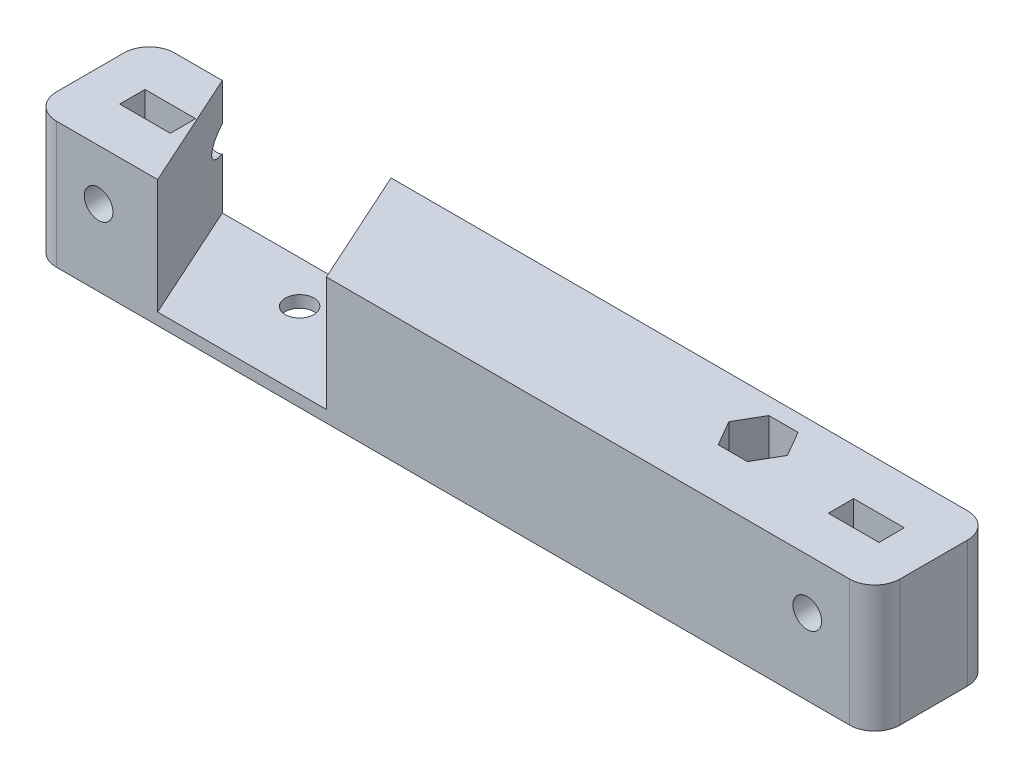
ISO-10303-21;
HEADER;
FILE_DESCRIPTION(('STEP AP214'),'2;1');
FILE_NAME('part.step','',(''),(''),'','','');
FILE_SCHEMA(('AUTOMOTIVE_DESIGN { 1 0 10303 214 1 1 1 1 }'));
ENDSEC;
DATA;
#1=APPLICATION_CONTEXT('core data for automotive mechanical design processes');
#2=APPLICATION_PROTOCOL_DEFINITION('international standard','automotive_design',2000,#1);
#3=PRODUCT_CONTEXT('',#1,'mechanical');
#4=PRODUCT('Part','Part','',(#3));
#5=PRODUCT_RELATED_PRODUCT_CATEGORY('part','',(#4));
#6=PRODUCT_DEFINITION_FORMATION('','',#4);
#7=PRODUCT_DEFINITION_CONTEXT('part definition',#1,'design');
#8=PRODUCT_DEFINITION('design','',#6,#7);
#9=PRODUCT_DEFINITION_SHAPE('','',#8);
#10=(LENGTH_UNIT() NAMED_UNIT(*) SI_UNIT(.MILLI.,.METRE.));
#11=(NAMED_UNIT(*) PLANE_ANGLE_UNIT() SI_UNIT($,.RADIAN.));
#12=(NAMED_UNIT(*) SI_UNIT($,.STERADIAN.) SOLID_ANGLE_UNIT());
#13=UNCERTAINTY_MEASURE_WITH_UNIT(LENGTH_MEASURE(1.E-05),#10,'distance_accuracy_value','');
#14=(GEOMETRIC_REPRESENTATION_CONTEXT(3) GLOBAL_UNCERTAINTY_ASSIGNED_CONTEXT((#13)) GLOBAL_UNIT_ASSIGNED_CONTEXT((#10,
#11,#12)) REPRESENTATION_CONTEXT('',''));
#15=CARTESIAN_POINT('',(0.,0.,0.));
#16=DIRECTION('',(0.,0.,1.));
#17=DIRECTION('',(1.,0.,0.));
#18=AXIS2_PLACEMENT_3D('',#15,#16,#17);
#19=CARTESIAN_POINT('',(0.,15.,0.));
#20=DIRECTION('',(0.,1.,0.));
#21=DIRECTION('',(0.,0.,1.));
#22=AXIS2_PLACEMENT_3D('',#19,#20,#21);
#23=PLANE('',#22);
#24=DIRECTION('',(0.412425555474587,0.,0.910991306869324));
#25=VECTOR('',#24,1.);
#26=CARTESIAN_POINT('',(-35.,15.,7.));
#27=LINE('',#26,#25);
#28=CARTESIAN_POINT('',(-41.3381041433719,15.,-7.));
#29=VERTEX_POINT('',#28);
#30=CARTESIAN_POINT('',(-35.,15.,7.));
#31=VERTEX_POINT('',#30);
#32=EDGE_CURVE('E252',#29,#31,#27,.T.);
#33=ORIENTED_EDGE('',*,*,#32,.F.);
#34=DIRECTION('',(-1.,0.,0.));
#35=VECTOR('',#34,1.);
#36=CARTESIAN_POINT('',(-50.,15.,-7.));
#37=LINE('',#36,#35);
#38=CARTESIAN_POINT('',(-47.,15.,-7.));
#39=VERTEX_POINT('',#38);
#40=EDGE_CURVE('E463',#29,#39,#37,.T.);
#41=ORIENTED_EDGE('',*,*,#40,.T.);
#42=CARTESIAN_POINT('',(-47.,15.,-4.));
#43=DIRECTION('',(0.,1.,0.));
#44=DIRECTION('',(0.,0.,1.));
#45=AXIS2_PLACEMENT_3D('',#42,#43,#44);
#46=CIRCLE('',#45,3.);
#47=CARTESIAN_POINT('',(-50.,15.,-4.));
#48=VERTEX_POINT('',#47);
#49=EDGE_CURVE('E546',#39,#48,#46,.T.);
#50=ORIENTED_EDGE('',*,*,#49,.T.);
#51=DIRECTION('',(0.,0.,1.));
#52=VECTOR('',#51,1.);
#53=CARTESIAN_POINT('',(-50.,15.,-7.));
#54=LINE('',#53,#52);
#55=CARTESIAN_POINT('',(-50.,15.,4.));
#56=VERTEX_POINT('',#55);
#57=EDGE_CURVE('E469',#48,#56,#54,.T.);
#58=ORIENTED_EDGE('',*,*,#57,.T.);
#59=CARTESIAN_POINT('',(-47.,15.,4.));
#60=DIRECTION('',(0.,1.,0.));
#61=DIRECTION('',(0.,0.,1.));
#62=AXIS2_PLACEMENT_3D('',#59,#60,#61);
#63=CIRCLE('',#62,3.);
#64=CARTESIAN_POINT('',(-47.,15.,7.));
#65=VERTEX_POINT('',#64);
#66=EDGE_CURVE('E549',#56,#65,#63,.T.);
#67=ORIENTED_EDGE('',*,*,#66,.T.);
#68=DIRECTION('',(1.,0.,0.));
#69=VECTOR('',#68,1.);
#70=CARTESIAN_POINT('',(-50.,15.,7.));
#71=LINE('',#70,#69);
#72=EDGE_CURVE('E473',#65,#31,#71,.T.);
#73=ORIENTED_EDGE('',*,*,#72,.T.);
#74=EDGE_LOOP('',(#33,#41,#50,#58,#67,#73));
#75=FACE_BOUND('',#74,.T.);
#76=DIRECTION('',(0.,0.,1.));
#77=VECTOR('',#76,1.);
#78=CARTESIAN_POINT('',(-45.0000000000159,15.,0.));
#79=LINE('',#78,#77);
#80=CARTESIAN_POINT('',(-45.0000000000159,14.9999999999864,-1.5));
#81=VERTEX_POINT('',#80);
#82=CARTESIAN_POINT('',(-45.0000000000159,15.,1.5));
#83=VERTEX_POINT('',#82);
#84=EDGE_CURVE('E510',#81,#83,#79,.T.);
#85=ORIENTED_EDGE('',*,*,#84,.F.);
#86=DIRECTION('',(1.,0.,0.));
#87=VECTOR('',#86,1.);
#88=CARTESIAN_POINT('',(0.,15.,-1.5));
#89=LINE('',#88,#87);
#90=CARTESIAN_POINT('',(-38.9999999999873,14.9999999999864,-1.5));
#91=VERTEX_POINT('',#90);
#92=EDGE_CURVE('E421',#81,#91,#89,.T.);
#93=ORIENTED_EDGE('',*,*,#92,.T.);
#94=DIRECTION('',(0.,0.,-1.));
#95=VECTOR('',#94,1.);
#96=CARTESIAN_POINT('',(-38.9999999999873,15.,0.));
#97=LINE('',#96,#95);
#98=CARTESIAN_POINT('',(-38.9999999999873,14.9999999999864,1.5));
#99=VERTEX_POINT('',#98);
#100=EDGE_CURVE('E514',#99,#91,#97,.T.);
#101=ORIENTED_EDGE('',*,*,#100,.F.);
#102=DIRECTION('',(1.,0.,0.));
#103=VECTOR('',#102,1.);
#104=CARTESIAN_POINT('',(0.,15.,1.5));
#105=LINE('',#104,#103);
#106=EDGE_CURVE('E417',#83,#99,#105,.T.);
#107=ORIENTED_EDGE('',*,*,#106,.F.);
#108=EDGE_LOOP('',(#85,#93,#101,#107));
#109=FACE_BOUND('',#108,.T.);
#110=ADVANCED_FACE('F43',(#75,#109),#23,.T.);
#111=DIRECTION('',(-0.412425555474587,0.,-0.910991306869324));
#112=VECTOR('',#111,1.);
#113=CARTESIAN_POINT('',(-21.3381041433719,15.,-7.));
#114=LINE('',#113,#112);
#115=CARTESIAN_POINT('',(-15.,15.,7.));
#116=VERTEX_POINT('',#115);
#117=CARTESIAN_POINT('',(-21.3381041433719,15.,-7.));
#118=VERTEX_POINT('',#117);
#119=EDGE_CURVE('E614',#116,#118,#114,.T.);
#120=ORIENTED_EDGE('',*,*,#119,.F.);
#121=CARTESIAN_POINT('',(47.,15.,7.));
#122=VERTEX_POINT('',#121);
#123=EDGE_CURVE('E68',#116,#122,#71,.T.);
#124=ORIENTED_EDGE('',*,*,#123,.T.);
#125=CARTESIAN_POINT('',(47.,15.,4.));
#126=DIRECTION('',(0.,1.,0.));
#127=DIRECTION('',(0.,0.,1.));
#128=AXIS2_PLACEMENT_3D('',#125,#126,#127);
#129=CIRCLE('',#128,3.);
#130=CARTESIAN_POINT('',(50.,15.,4.));
#131=VERTEX_POINT('',#130);
#132=EDGE_CURVE('E552',#122,#131,#129,.T.);
#133=ORIENTED_EDGE('',*,*,#132,.T.);
#134=DIRECTION('',(0.,0.,-1.));
#135=VECTOR('',#134,1.);
#136=CARTESIAN_POINT('',(50.,15.,-7.));
#137=LINE('',#136,#135);
#138=CARTESIAN_POINT('',(50.,15.,-4.));
#139=VERTEX_POINT('',#138);
#140=EDGE_CURVE('E459',#131,#139,#137,.T.);
#141=ORIENTED_EDGE('',*,*,#140,.T.);
#142=CARTESIAN_POINT('',(47.,15.,-4.));
#143=DIRECTION('',(0.,1.,0.));
#144=DIRECTION('',(0.,0.,1.));
#145=AXIS2_PLACEMENT_3D('',#142,#143,#144);
#146=CIRCLE('',#145,3.);
#147=CARTESIAN_POINT('',(47.,15.,-7.));
#148=VERTEX_POINT('',#147);
#149=EDGE_CURVE('E555',#139,#148,#146,.T.);
#150=ORIENTED_EDGE('',*,*,#149,.T.);
#151=EDGE_CURVE('E465',#148,#118,#37,.T.);
#152=ORIENTED_EDGE('',*,*,#151,.T.);
#153=EDGE_LOOP('',(#120,#124,#133,#141,#150,#152));
#154=FACE_BOUND('',#153,.T.);
#155=DIRECTION('',(1.,0.,0.));
#156=VECTOR('',#155,1.);
#157=CARTESIAN_POINT('',(28.9070508075689,15.,1.));
#158=LINE('',#157,#156);
#159=CARTESIAN_POINT('',(25.4429491924311,15.,1.));
#160=VERTEX_POINT('',#159);
#161=CARTESIAN_POINT('',(28.9070508075689,15.,1.));
#162=VERTEX_POINT('',#161);
#163=EDGE_CURVE('E270',#160,#162,#158,.T.);
#164=ORIENTED_EDGE('',*,*,#163,.F.);
#165=DIRECTION('',(0.5,0.,0.866025403784438));
#166=VECTOR('',#165,1.);
#167=CARTESIAN_POINT('',(25.4429491924311,15.,1.));
#168=LINE('',#167,#166);
#169=CARTESIAN_POINT('',(23.7108983848622,15.,-1.99999999999999));
#170=VERTEX_POINT('',#169);
#171=EDGE_CURVE('E276',#170,#160,#168,.T.);
#172=ORIENTED_EDGE('',*,*,#171,.F.);
#173=DIRECTION('',(-0.5,0.,0.866025403784439));
#174=VECTOR('',#173,1.);
#175=CARTESIAN_POINT('',(23.7108983848622,15.,-1.99999999999999));
#176=LINE('',#175,#174);
#177=CARTESIAN_POINT('',(25.4429491924311,15.,-4.99999999999999));
#178=VERTEX_POINT('',#177);
#179=EDGE_CURVE('E311',#178,#170,#176,.T.);
#180=ORIENTED_EDGE('',*,*,#179,.F.);
#181=DIRECTION('',(-1.,0.,0.));
#182=VECTOR('',#181,1.);
#183=CARTESIAN_POINT('',(25.4429491924311,15.,-4.99999999999999));
#184=LINE('',#183,#182);
#185=CARTESIAN_POINT('',(28.9070508075689,15.,-4.99999999999999));
#186=VERTEX_POINT('',#185);
#187=EDGE_CURVE('E307',#186,#178,#184,.T.);
#188=ORIENTED_EDGE('',*,*,#187,.F.);
#189=DIRECTION('',(-0.500000000000001,0.,-0.866025403784438));
#190=VECTOR('',#189,1.);
#191=CARTESIAN_POINT('',(28.9070508075689,15.,-4.99999999999999));
#192=LINE('',#191,#190);
#193=CARTESIAN_POINT('',(30.6391016151378,15.,-1.99999999999999));
#194=VERTEX_POINT('',#193);
#195=EDGE_CURVE('E303',#194,#186,#192,.T.);
#196=ORIENTED_EDGE('',*,*,#195,.F.);
#197=DIRECTION('',(0.500000000000001,0.,-0.866025403784438));
#198=VECTOR('',#197,1.);
#199=CARTESIAN_POINT('',(30.6391016151378,15.,-1.99999999999999));
#200=LINE('',#199,#198);
#201=EDGE_CURVE('E299',#162,#194,#200,.T.);
#202=ORIENTED_EDGE('',*,*,#201,.F.);
#203=EDGE_LOOP('',(#164,#172,#180,#188,#196,#202));
#204=FACE_BOUND('',#203,.T.);
#205=DIRECTION('',(0.,0.,1.));
#206=VECTOR('',#205,1.);
#207=CARTESIAN_POINT('',(38.9999999999873,15.,0.));
#208=LINE('',#207,#206);
#209=CARTESIAN_POINT('',(38.9999999999873,14.9999999999864,-1.5));
#210=VERTEX_POINT('',#209);
#211=CARTESIAN_POINT('',(38.9999999999873,15.,1.5));
#212=VERTEX_POINT('',#211);
#213=EDGE_CURVE('E477',#210,#212,#208,.T.);
#214=ORIENTED_EDGE('',*,*,#213,.F.);
#215=DIRECTION('',(1.,0.,0.));
#216=VECTOR('',#215,1.);
#217=CARTESIAN_POINT('',(0.,15.,-1.5));
#218=LINE('',#217,#216);
#219=CARTESIAN_POINT('',(45.0000000000159,14.9999999999864,-1.5));
#220=VERTEX_POINT('',#219);
#221=EDGE_CURVE('E430',#210,#220,#218,.T.);
#222=ORIENTED_EDGE('',*,*,#221,.T.);
#223=DIRECTION('',(0.,0.,-1.));
#224=VECTOR('',#223,1.);
#225=CARTESIAN_POINT('',(45.0000000000159,15.,0.));
#226=LINE('',#225,#224);
#227=CARTESIAN_POINT('',(45.0000000000159,14.9999999999864,1.5));
#228=VERTEX_POINT('',#227);
#229=EDGE_CURVE('E507',#228,#220,#226,.T.);
#230=ORIENTED_EDGE('',*,*,#229,.F.);
#231=DIRECTION('',(1.,0.,0.));
#232=VECTOR('',#231,1.);
#233=CARTESIAN_POINT('',(0.,15.,1.5));
#234=LINE('',#233,#232);
#235=EDGE_CURVE('E426',#212,#228,#234,.T.);
#236=ORIENTED_EDGE('',*,*,#235,.F.);
#237=EDGE_LOOP('',(#214,#222,#230,#236));
#238=FACE_BOUND('',#237,.T.);
#239=ADVANCED_FACE('F607',(#154,#204,#238),#23,.T.);
#240=CARTESIAN_POINT('',(42.,9.,-7.));
#241=DIRECTION('',(0.,0.,1.));
#242=DIRECTION('',(1.,0.,0.));
#243=AXIS2_PLACEMENT_3D('',#240,#241,#242);
#244=CYLINDRICAL_SURFACE('',#243,1.7);
#245=CARTESIAN_POINT('',(42.,9.,-7.));
#246=DIRECTION('',(0.,0.,1.));
#247=DIRECTION('',(1.,0.,0.));
#248=AXIS2_PLACEMENT_3D('',#245,#246,#247);
#249=CIRCLE('',#248,1.7);
#250=CARTESIAN_POINT('',(43.7,9.,-7.));
#251=VERTEX_POINT('',#250);
#252=EDGE_CURVE('E434',#251,#251,#249,.T.);
#253=ORIENTED_EDGE('',*,*,#252,.F.);
#254=EDGE_LOOP('',(#253));
#255=FACE_BOUND('',#254,.T.);
#256=CARTESIAN_POINT('',(42.,9.,-1.5));
#257=DIRECTION('',(0.,0.,1.));
#258=DIRECTION('',(1.,0.,0.));
#259=AXIS2_PLACEMENT_3D('',#256,#257,#258);
#260=CIRCLE('',#259,1.7);
#261=CARTESIAN_POINT('',(43.7,9.,-1.5));
#262=VERTEX_POINT('',#261);
#263=EDGE_CURVE('E429',#262,#262,#260,.F.);
#264=ORIENTED_EDGE('',*,*,#263,.F.);
#265=EDGE_LOOP('',(#264));
#266=FACE_BOUND('',#265,.T.);
#267=ADVANCED_FACE('F630',(#255,#266),#244,.F.);
#268=CARTESIAN_POINT('',(-42.,9.,-7.));
#269=DIRECTION('',(0.,0.,1.));
#270=DIRECTION('',(1.,0.,0.));
#271=AXIS2_PLACEMENT_3D('',#268,#269,#270);
#272=CYLINDRICAL_SURFACE('',#271,1.7);
#273=CARTESIAN_POINT('',(-42.,9.,-7.));
#274=DIRECTION('',(0.,0.,1.));
#275=DIRECTION('',(1.,0.,0.));
#276=AXIS2_PLACEMENT_3D('',#273,#274,#275);
#277=CIRCLE('',#276,1.7);
#278=CARTESIAN_POINT('',(-41.3381041433719,10.5658524435522,-7.));
#279=VERTEX_POINT('',#278);
#280=CARTESIAN_POINT('',(-41.3381041433719,7.43414755644776,-7.));
#281=VERTEX_POINT('',#280);
#282=EDGE_CURVE('E435',#279,#281,#277,.T.);
#283=ORIENTED_EDGE('',*,*,#282,.F.);
#284=CARTESIAN_POINT('',(-42.,9.,-8.46203687777589));
#285=DIRECTION('',(-0.910991306869324,0.,0.412425555474587));
#286=DIRECTION('',(0.412425555474587,0.,0.910991306869324));
#287=AXIS2_PLACEMENT_3D('',#284,#285,#286);
#288=ELLIPSE('',#287,4.12195601711386,1.7);
#289=EDGE_CURVE('E266',#279,#281,#288,.F.);
#290=ORIENTED_EDGE('',*,*,#289,.T.);
#291=EDGE_LOOP('',(#283,#290));
#292=FACE_BOUND('',#291,.T.);
#293=CARTESIAN_POINT('',(-42.,9.,-1.5));
#294=DIRECTION('',(0.,0.,1.));
#295=DIRECTION('',(1.,0.,0.));
#296=AXIS2_PLACEMENT_3D('',#293,#294,#295);
#297=CIRCLE('',#296,1.7);
#298=CARTESIAN_POINT('',(-40.3,9.,-1.5));
#299=VERTEX_POINT('',#298);
#300=EDGE_CURVE('E420',#299,#299,#297,.F.);
#301=ORIENTED_EDGE('',*,*,#300,.F.);
#302=EDGE_LOOP('',(#301));
#303=FACE_BOUND('',#302,.T.);
#304=ADVANCED_FACE('F627',(#292,#303),#272,.F.);
#305=CARTESIAN_POINT('',(0.,0.,0.));
#306=DIRECTION('',(0.,1.,0.));
#307=DIRECTION('',(0.,0.,1.));
#308=AXIS2_PLACEMENT_3D('',#305,#306,#307);
#309=PLANE('',#308);
#310=DIRECTION('',(-1.,0.,0.));
#311=VECTOR('',#310,1.);
#312=CARTESIAN_POINT('',(-50.,0.,-7.));
#313=LINE('',#312,#311);
#314=CARTESIAN_POINT('',(47.,0.,-7.));
#315=VERTEX_POINT('',#314);
#316=CARTESIAN_POINT('',(-47.,0.,-7.));
#317=VERTEX_POINT('',#316);
#318=EDGE_CURVE('E481',#315,#317,#313,.T.);
#319=ORIENTED_EDGE('',*,*,#318,.F.);
#320=CARTESIAN_POINT('',(47.,0.,-4.));
#321=DIRECTION('',(0.,1.,0.));
#322=DIRECTION('',(0.,0.,1.));
#323=AXIS2_PLACEMENT_3D('',#320,#321,#322);
#324=CIRCLE('',#323,3.);
#325=CARTESIAN_POINT('',(50.,0.,-4.));
#326=VERTEX_POINT('',#325);
#327=EDGE_CURVE('E536',#315,#326,#324,.F.);
#328=ORIENTED_EDGE('',*,*,#327,.T.);
#329=DIRECTION('',(0.,0.,-1.));
#330=VECTOR('',#329,1.);
#331=CARTESIAN_POINT('',(50.,0.,-7.));
#332=LINE('',#331,#330);
#333=CARTESIAN_POINT('',(50.,0.,4.));
#334=VERTEX_POINT('',#333);
#335=EDGE_CURVE('E458',#334,#326,#332,.T.);
#336=ORIENTED_EDGE('',*,*,#335,.F.);
#337=CARTESIAN_POINT('',(47.,0.,4.));
#338=DIRECTION('',(0.,1.,0.));
#339=DIRECTION('',(0.,0.,1.));
#340=AXIS2_PLACEMENT_3D('',#337,#338,#339);
#341=CIRCLE('',#340,3.);
#342=CARTESIAN_POINT('',(47.,0.,7.));
#343=VERTEX_POINT('',#342);
#344=EDGE_CURVE('E533',#334,#343,#341,.F.);
#345=ORIENTED_EDGE('',*,*,#344,.T.);
#346=DIRECTION('',(1.,0.,0.));
#347=VECTOR('',#346,1.);
#348=CARTESIAN_POINT('',(-50.,0.,7.));
#349=LINE('',#348,#347);
#350=CARTESIAN_POINT('',(-47.,0.,7.));
#351=VERTEX_POINT('',#350);
#352=EDGE_CURVE('E464',#351,#343,#349,.T.);
#353=ORIENTED_EDGE('',*,*,#352,.F.);
#354=CARTESIAN_POINT('',(-47.,0.,4.));
#355=DIRECTION('',(0.,1.,0.));
#356=DIRECTION('',(0.,0.,1.));
#357=AXIS2_PLACEMENT_3D('',#354,#355,#356);
#358=CIRCLE('',#357,3.);
#359=CARTESIAN_POINT('',(-50.,0.,4.));
#360=VERTEX_POINT('',#359);
#361=EDGE_CURVE('E530',#351,#360,#358,.F.);
#362=ORIENTED_EDGE('',*,*,#361,.T.);
#363=DIRECTION('',(0.,0.,1.));
#364=VECTOR('',#363,1.);
#365=CARTESIAN_POINT('',(-50.,0.,-7.));
#366=LINE('',#365,#364);
#367=CARTESIAN_POINT('',(-50.,0.,-4.));
#368=VERTEX_POINT('',#367);
#369=EDGE_CURVE('E485',#368,#360,#366,.T.);
#370=ORIENTED_EDGE('',*,*,#369,.F.);
#371=CARTESIAN_POINT('',(-47.,0.,-4.));
#372=DIRECTION('',(0.,1.,0.));
#373=DIRECTION('',(0.,0.,1.));
#374=AXIS2_PLACEMENT_3D('',#371,#372,#373);
#375=CIRCLE('',#374,3.);
#376=EDGE_CURVE('E527',#368,#317,#375,.F.);
#377=ORIENTED_EDGE('',*,*,#376,.T.);
#378=EDGE_LOOP('',(#319,#328,#336,#345,#353,#362,#370,#377));
#379=FACE_BOUND('',#378,.T.);
#380=CARTESIAN_POINT('',(-27.175,0.,-2.));
#381=DIRECTION('',(0.,1.,0.));
#382=DIRECTION('',(0.,0.,1.));
#383=AXIS2_PLACEMENT_3D('',#380,#381,#382);
#384=CIRCLE('',#383,1.7);
#385=CARTESIAN_POINT('',(-27.175,0.,-0.300000000000001));
#386=VERTEX_POINT('',#385);
#387=EDGE_CURVE('E454',#386,#386,#384,.T.);
#388=ORIENTED_EDGE('',*,*,#387,.T.);
#389=EDGE_LOOP('',(#388));
#390=FACE_BOUND('',#389,.T.);
#391=CARTESIAN_POINT('',(27.175,0.,-2.));
#392=DIRECTION('',(0.,1.,0.));
#393=DIRECTION('',(0.,0.,1.));
#394=AXIS2_PLACEMENT_3D('',#391,#392,#393);
#395=CIRCLE('',#394,1.7);
#396=CARTESIAN_POINT('',(27.175,0.,-0.300000000000001));
#397=VERTEX_POINT('',#396);
#398=EDGE_CURVE('E439',#397,#397,#395,.T.);
#399=ORIENTED_EDGE('',*,*,#398,.T.);
#400=EDGE_LOOP('',(#399));
#401=FACE_BOUND('',#400,.T.);
#402=ADVANCED_FACE('F577',(#379,#390,#401),#309,.F.);
#403=CARTESIAN_POINT('',(50.,15.,-7.));
#404=DIRECTION('',(-1.,0.,0.));
#405=DIRECTION('',(0.,0.,1.));
#406=AXIS2_PLACEMENT_3D('',#403,#404,#405);
#407=PLANE('',#406);
#408=ORIENTED_EDGE('',*,*,#335,.T.);
#409=DIRECTION('',(0.,-1.,0.));
#410=VECTOR('',#409,1.);
#411=CARTESIAN_POINT('',(50.,15.,-4.));
#412=LINE('',#411,#410);
#413=EDGE_CURVE('E543',#326,#139,#412,.F.);
#414=ORIENTED_EDGE('',*,*,#413,.T.);
#415=ORIENTED_EDGE('',*,*,#140,.F.);
#416=DIRECTION('',(0.,-1.,0.));
#417=VECTOR('',#416,1.);
#418=CARTESIAN_POINT('',(50.,15.,4.));
#419=LINE('',#418,#417);
#420=EDGE_CURVE('E539',#131,#334,#419,.T.);
#421=ORIENTED_EDGE('',*,*,#420,.T.);
#422=EDGE_LOOP('',(#408,#414,#415,#421));
#423=FACE_BOUND('',#422,.T.);
#424=ADVANCED_FACE('F602',(#423),#407,.F.);
#425=CARTESIAN_POINT('',(-50.,15.,-7.));
#426=DIRECTION('',(0.,0.,1.));
#427=DIRECTION('',(1.,0.,0.));
#428=AXIS2_PLACEMENT_3D('',#425,#426,#427);
#429=PLANE('',#428);
#430=ORIENTED_EDGE('',*,*,#40,.F.);
#431=DIRECTION('',(0.,1.,0.));
#432=VECTOR('',#431,1.);
#433=CARTESIAN_POINT('',(-41.3381041433719,1.4,-7.));
#434=LINE('',#433,#432);
#435=EDGE_CURVE('E260',#279,#29,#434,.T.);
#436=ORIENTED_EDGE('',*,*,#435,.F.);
#437=ORIENTED_EDGE('',*,*,#282,.T.);
#438=CARTESIAN_POINT('',(-41.3381041433719,1.4,-7.));
#439=VERTEX_POINT('',#438);
#440=EDGE_CURVE('E610',#439,#281,#434,.T.);
#441=ORIENTED_EDGE('',*,*,#440,.F.);
#442=DIRECTION('',(-1.,0.,0.));
#443=VECTOR('',#442,1.);
#444=CARTESIAN_POINT('',(-41.3381041433719,1.4,-7.));
#445=LINE('',#444,#443);
#446=CARTESIAN_POINT('',(-21.3381041433719,1.4,-7.));
#447=VERTEX_POINT('',#446);
#448=EDGE_CURVE('E244',#447,#439,#445,.T.);
#449=ORIENTED_EDGE('',*,*,#448,.F.);
#450=DIRECTION('',(0.,1.,0.));
#451=VECTOR('',#450,1.);
#452=CARTESIAN_POINT('',(-21.3381041433719,1.4,-7.));
#453=LINE('',#452,#451);
#454=EDGE_CURVE('E241',#447,#118,#453,.T.);
#455=ORIENTED_EDGE('',*,*,#454,.T.);
#456=ORIENTED_EDGE('',*,*,#151,.F.);
#457=DIRECTION('',(0.,-1.,0.));
#458=VECTOR('',#457,1.);
#459=CARTESIAN_POINT('',(47.,15.,-7.));
#460=LINE('',#459,#458);
#461=EDGE_CURVE('E524',#148,#315,#460,.T.);
#462=ORIENTED_EDGE('',*,*,#461,.T.);
#463=ORIENTED_EDGE('',*,*,#318,.T.);
#464=DIRECTION('',(0.,-1.,0.));
#465=VECTOR('',#464,1.);
#466=CARTESIAN_POINT('',(-47.,15.,-7.));
#467=LINE('',#466,#465);
#468=EDGE_CURVE('E517',#317,#39,#467,.F.);
#469=ORIENTED_EDGE('',*,*,#468,.T.);
#470=EDGE_LOOP('',(#430,#436,#437,#441,#449,#455,#456,#462,#463,#469));
#471=FACE_BOUND('',#470,.T.);
#472=ORIENTED_EDGE('',*,*,#252,.T.);
#473=EDGE_LOOP('',(#472));
#474=FACE_BOUND('',#473,.T.);
#475=ADVANCED_FACE('F593',(#471,#474),#429,.F.);
#476=CARTESIAN_POINT('',(-50.,15.,-7.));
#477=DIRECTION('',(1.,0.,0.));
#478=DIRECTION('',(0.,0.,-1.));
#479=AXIS2_PLACEMENT_3D('',#476,#477,#478);
#480=PLANE('',#479);
#481=ORIENTED_EDGE('',*,*,#369,.T.);
#482=DIRECTION('',(0.,-1.,0.));
#483=VECTOR('',#482,1.);
#484=CARTESIAN_POINT('',(-50.,15.,4.));
#485=LINE('',#484,#483);
#486=EDGE_CURVE('E11',#360,#56,#485,.F.);
#487=ORIENTED_EDGE('',*,*,#486,.T.);
#488=ORIENTED_EDGE('',*,*,#57,.F.);
#489=DIRECTION('',(0.,-1.,0.));
#490=VECTOR('',#489,1.);
#491=CARTESIAN_POINT('',(-50.,15.,-4.));
#492=LINE('',#491,#490);
#493=EDGE_CURVE('E53',#48,#368,#492,.T.);
#494=ORIENTED_EDGE('',*,*,#493,.T.);
#495=EDGE_LOOP('',(#481,#487,#488,#494));
#496=FACE_BOUND('',#495,.T.);
#497=ADVANCED_FACE('F571',(#496),#480,.F.);
#498=CARTESIAN_POINT('',(-50.,15.,7.));
#499=DIRECTION('',(0.,0.,-1.));
#500=DIRECTION('',(-1.,0.,0.));
#501=AXIS2_PLACEMENT_3D('',#498,#499,#500);
#502=PLANE('',#501);
#503=CARTESIAN_POINT('',(-42.,9.,7.));
#504=DIRECTION('',(0.,0.,1.));
#505=DIRECTION('',(1.,0.,0.));
#506=AXIS2_PLACEMENT_3D('',#503,#504,#505);
#507=CIRCLE('',#506,1.7);
#508=CARTESIAN_POINT('',(-40.3,9.,7.));
#509=VERTEX_POINT('',#508);
#510=EDGE_CURVE('E440',#509,#509,#507,.T.);
#511=ORIENTED_EDGE('',*,*,#510,.F.);
#512=EDGE_LOOP('',(#511));
#513=FACE_BOUND('',#512,.T.);
#514=CARTESIAN_POINT('',(42.,9.,7.));
#515=DIRECTION('',(0.,0.,1.));
#516=DIRECTION('',(1.,0.,0.));
#517=AXIS2_PLACEMENT_3D('',#514,#515,#516);
#518=CIRCLE('',#517,1.7);
#519=CARTESIAN_POINT('',(43.7,9.,7.));
#520=VERTEX_POINT('',#519);
#521=EDGE_CURVE('E444',#520,#520,#518,.T.);
#522=ORIENTED_EDGE('',*,*,#521,.F.);
#523=EDGE_LOOP('',(#522));
#524=FACE_BOUND('',#523,.T.);
#525=DIRECTION('',(1.,0.,0.));
#526=VECTOR('',#525,1.);
#527=CARTESIAN_POINT('',(-15.,1.4,7.));
#528=LINE('',#527,#526);
#529=CARTESIAN_POINT('',(-35.,1.4,7.));
#530=VERTEX_POINT('',#529);
#531=CARTESIAN_POINT('',(-15.,1.4,7.));
#532=VERTEX_POINT('',#531);
#533=EDGE_CURVE('E245',#530,#532,#528,.T.);
#534=ORIENTED_EDGE('',*,*,#533,.F.);
#535=DIRECTION('',(0.,1.,0.));
#536=VECTOR('',#535,1.);
#537=CARTESIAN_POINT('',(-35.,1.4,7.));
#538=LINE('',#537,#536);
#539=EDGE_CURVE('E586',#530,#31,#538,.T.);
#540=ORIENTED_EDGE('',*,*,#539,.T.);
#541=ORIENTED_EDGE('',*,*,#72,.F.);
#542=DIRECTION('',(0.,-1.,0.));
#543=VECTOR('',#542,1.);
#544=CARTESIAN_POINT('',(-47.,15.,7.));
#545=LINE('',#544,#543);
#546=EDGE_CURVE('E558',#65,#351,#545,.T.);
#547=ORIENTED_EDGE('',*,*,#546,.T.);
#548=ORIENTED_EDGE('',*,*,#352,.T.);
#549=DIRECTION('',(0.,-1.,0.));
#550=VECTOR('',#549,1.);
#551=CARTESIAN_POINT('',(47.,15.,7.));
#552=LINE('',#551,#550);
#553=EDGE_CURVE('E562',#343,#122,#552,.F.);
#554=ORIENTED_EDGE('',*,*,#553,.T.);
#555=ORIENTED_EDGE('',*,*,#123,.F.);
#556=DIRECTION('',(0.,1.,0.));
#557=VECTOR('',#556,1.);
#558=CARTESIAN_POINT('',(-15.,1.4,7.));
#559=LINE('',#558,#557);
#560=EDGE_CURVE('E239',#532,#116,#559,.T.);
#561=ORIENTED_EDGE('',*,*,#560,.F.);
#562=EDGE_LOOP('',(#534,#540,#541,#547,#548,#554,#555,#561));
#563=FACE_BOUND('',#562,.T.);
#564=ADVANCED_FACE('F254',(#513,#524,#563),#502,.F.);
#565=CARTESIAN_POINT('',(-27.175,15.,-2.));
#566=DIRECTION('',(0.,-1.,0.));
#567=DIRECTION('',(0.,0.,-1.));
#568=AXIS2_PLACEMENT_3D('',#565,#566,#567);
#569=CYLINDRICAL_SURFACE('',#568,1.7);
#570=CARTESIAN_POINT('',(-27.175,1.4,-2.));
#571=DIRECTION('',(0.,-1.,0.));
#572=DIRECTION('',(0.,0.,-1.));
#573=AXIS2_PLACEMENT_3D('',#570,#571,#572);
#574=CIRCLE('',#573,1.7);
#575=CARTESIAN_POINT('',(-27.175,1.4,-3.7));
#576=VERTEX_POINT('',#575);
#577=EDGE_CURVE('E47',#576,#576,#574,.T.);
#578=ORIENTED_EDGE('',*,*,#577,.F.);
#579=EDGE_LOOP('',(#578));
#580=FACE_BOUND('',#579,.T.);
#581=ORIENTED_EDGE('',*,*,#387,.F.);
#582=EDGE_LOOP('',(#581));
#583=FACE_BOUND('',#582,.T.);
#584=ADVANCED_FACE('F655',(#580,#583),#569,.F.);
#585=CARTESIAN_POINT('',(27.175,15.,-2.));
#586=DIRECTION('',(0.,-1.,0.));
#587=DIRECTION('',(0.,0.,-1.));
#588=AXIS2_PLACEMENT_3D('',#585,#586,#587);
#589=CYLINDRICAL_SURFACE('',#588,1.7);
#590=CARTESIAN_POINT('',(27.175,9.,-2.));
#591=DIRECTION('',(0.,-1.,0.));
#592=DIRECTION('',(0.,0.,-1.));
#593=AXIS2_PLACEMENT_3D('',#590,#591,#592);
#594=CIRCLE('',#593,1.7);
#595=CARTESIAN_POINT('',(27.175,9.,-3.7));
#596=VERTEX_POINT('',#595);
#597=EDGE_CURVE('E321',#596,#596,#594,.T.);
#598=ORIENTED_EDGE('',*,*,#597,.F.);
#599=EDGE_LOOP('',(#598));
#600=FACE_BOUND('',#599,.T.);
#601=ORIENTED_EDGE('',*,*,#398,.F.);
#602=EDGE_LOOP('',(#601));
#603=FACE_BOUND('',#602,.T.);
#604=ADVANCED_FACE('F767',(#600,#603),#589,.F.);
#605=CARTESIAN_POINT('',(42.,9.,1.5));
#606=DIRECTION('',(0.,0.,1.));
#607=DIRECTION('',(1.,0.,0.));
#608=AXIS2_PLACEMENT_3D('',#605,#606,#607);
#609=CIRCLE('',#608,1.7);
#610=CARTESIAN_POINT('',(43.7,9.,1.5));
#611=VERTEX_POINT('',#610);
#612=EDGE_CURVE('E425',#611,#611,#609,.F.);
#613=ORIENTED_EDGE('',*,*,#612,.T.);
#614=EDGE_LOOP('',(#613));
#615=FACE_BOUND('',#614,.T.);
#616=ORIENTED_EDGE('',*,*,#521,.T.);
#617=EDGE_LOOP('',(#616));
#618=FACE_BOUND('',#617,.T.);
#619=ADVANCED_FACE('F646',(#615,#618),#244,.F.);
#620=CARTESIAN_POINT('',(-42.,9.,1.5));
#621=DIRECTION('',(0.,0.,1.));
#622=DIRECTION('',(1.,0.,0.));
#623=AXIS2_PLACEMENT_3D('',#620,#621,#622);
#624=CIRCLE('',#623,1.7);
#625=CARTESIAN_POINT('',(-40.3,9.,1.5));
#626=VERTEX_POINT('',#625);
#627=EDGE_CURVE('E372',#626,#626,#624,.F.);
#628=ORIENTED_EDGE('',*,*,#627,.T.);
#629=EDGE_LOOP('',(#628));
#630=FACE_BOUND('',#629,.T.);
#631=ORIENTED_EDGE('',*,*,#510,.T.);
#632=EDGE_LOOP('',(#631));
#633=FACE_BOUND('',#632,.T.);
#634=ADVANCED_FACE('F632',(#630,#633),#272,.F.);
#635=CARTESIAN_POINT('',(0.,0.,-1.5));
#636=DIRECTION('',(0.,0.,1.));
#637=DIRECTION('',(1.,0.,0.));
#638=AXIS2_PLACEMENT_3D('',#635,#636,#637);
#639=PLANE('',#638);
#640=DIRECTION('',(0.,-1.,0.));
#641=VECTOR('',#640,1.);
#642=CARTESIAN_POINT('',(-45.0000000000159,-291584.25,-1.5));
#643=LINE('',#642,#641);
#644=CARTESIAN_POINT('',(-44.9999999999875,7.26794919242479,-1.5));
#645=VERTEX_POINT('',#644);
#646=EDGE_CURVE('E341',#81,#645,#643,.T.);
#647=ORIENTED_EDGE('',*,*,#646,.T.);
#648=DIRECTION('',(0.866025403784438,-0.5,0.));
#649=VECTOR('',#648,1.);
#650=CARTESIAN_POINT('',(-173748.418963966,100294.983647197,-1.5));
#651=LINE('',#650,#649);
#652=CARTESIAN_POINT('',(-41.9999999998595,5.53589838489188,-1.5));
#653=VERTEX_POINT('',#652);
#654=EDGE_CURVE('E345',#645,#653,#651,.T.);
#655=ORIENTED_EDGE('',*,*,#654,.T.);
#656=DIRECTION('',(0.866025403784439,0.5,0.));
#657=VECTOR('',#656,1.);
#658=CARTESIAN_POINT('',(-426272.581036033,-246078.804799619,-1.5));
#659=LINE('',#658,#657);
#660=CARTESIAN_POINT('',(-38.9999999999873,7.26794919245322,-1.5));
#661=VERTEX_POINT('',#660);
#662=EDGE_CURVE('E349',#653,#661,#659,.T.);
#663=ORIENTED_EDGE('',*,*,#662,.T.);
#664=DIRECTION('',(0.,1.,0.));
#665=VECTOR('',#664,1.);
#666=CARTESIAN_POINT('',(-38.9999999999873,-291584.25,-1.5));
#667=LINE('',#666,#665);
#668=EDGE_CURVE('E337',#661,#91,#667,.T.);
#669=ORIENTED_EDGE('',*,*,#668,.T.);
#670=ORIENTED_EDGE('',*,*,#92,.F.);
#671=EDGE_LOOP('',(#647,#655,#663,#669,#670));
#672=FACE_BOUND('',#671,.T.);
#673=ORIENTED_EDGE('',*,*,#300,.T.);
#674=EDGE_LOOP('',(#673));
#675=FACE_BOUND('',#674,.T.);
#676=ADVANCED_FACE('F635',(#672,#675),#639,.T.);
#677=CARTESIAN_POINT('',(0.,0.,1.5));
#678=DIRECTION('',(0.,0.,1.));
#679=DIRECTION('',(1.,0.,0.));
#680=AXIS2_PLACEMENT_3D('',#677,#678,#679);
#681=PLANE('',#680);
#682=ORIENTED_EDGE('',*,*,#106,.T.);
#683=DIRECTION('',(0.,1.,0.));
#684=VECTOR('',#683,1.);
#685=CARTESIAN_POINT('',(-38.9999999999873,-291584.25,1.5));
#686=LINE('',#685,#684);
#687=CARTESIAN_POINT('',(-38.9999999999873,7.26794919245322,1.5));
#688=VERTEX_POINT('',#687);
#689=EDGE_CURVE('E342',#688,#99,#686,.T.);
#690=ORIENTED_EDGE('',*,*,#689,.F.);
#691=DIRECTION('',(0.866025403784439,0.5,0.));
#692=VECTOR('',#691,1.);
#693=CARTESIAN_POINT('',(-426272.581036033,-246078.804799619,1.5));
#694=LINE('',#693,#692);
#695=CARTESIAN_POINT('',(-41.9999999998595,5.53589838489188,1.5));
#696=VERTEX_POINT('',#695);
#697=EDGE_CURVE('E362',#696,#688,#694,.T.);
#698=ORIENTED_EDGE('',*,*,#697,.F.);
#699=DIRECTION('',(0.866025403784438,-0.5,0.));
#700=VECTOR('',#699,1.);
#701=CARTESIAN_POINT('',(-173748.418963966,100294.983647197,1.5));
#702=LINE('',#701,#700);
#703=CARTESIAN_POINT('',(-44.9999999999875,7.26794919242479,1.5));
#704=VERTEX_POINT('',#703);
#705=EDGE_CURVE('E357',#704,#696,#702,.T.);
#706=ORIENTED_EDGE('',*,*,#705,.F.);
#707=DIRECTION('',(0.,-1.,0.));
#708=VECTOR('',#707,1.);
#709=CARTESIAN_POINT('',(-45.0000000000159,-291584.25,1.5));
#710=LINE('',#709,#708);
#711=EDGE_CURVE('E354',#83,#704,#710,.T.);
#712=ORIENTED_EDGE('',*,*,#711,.F.);
#713=EDGE_LOOP('',(#682,#690,#698,#706,#712));
#714=FACE_BOUND('',#713,.T.);
#715=ORIENTED_EDGE('',*,*,#627,.F.);
#716=EDGE_LOOP('',(#715));
#717=FACE_BOUND('',#716,.T.);
#718=ADVANCED_FACE('F637',(#714,#717),#681,.F.);
#719=CARTESIAN_POINT('',(-38.9999999999873,-291584.25,-1.5));
#720=DIRECTION('',(1.,0.,0.));
#721=DIRECTION('',(0.,0.,-1.));
#722=AXIS2_PLACEMENT_3D('',#719,#720,#721);
#723=PLANE('',#722);
#724=ORIENTED_EDGE('',*,*,#100,.T.);
#725=ORIENTED_EDGE('',*,*,#668,.F.);
#726=DIRECTION('',(0.,0.,1.));
#727=VECTOR('',#726,1.);
#728=CARTESIAN_POINT('',(-38.9999999999873,7.26794919245322,-1.5));
#729=LINE('',#728,#727);
#730=EDGE_CURVE('E369',#661,#688,#729,.T.);
#731=ORIENTED_EDGE('',*,*,#730,.T.);
#732=ORIENTED_EDGE('',*,*,#689,.T.);
#733=EDGE_LOOP('',(#724,#725,#731,#732));
#734=FACE_BOUND('',#733,.T.);
#735=ADVANCED_FACE('F643',(#734),#723,.F.);
#736=CARTESIAN_POINT('',(-426272.581036033,-246078.804799619,-1.5));
#737=DIRECTION('',(0.5,-0.866025403784439,0.));
#738=DIRECTION('',(0.866025403784439,0.5,0.));
#739=AXIS2_PLACEMENT_3D('',#736,#737,#738);
#740=PLANE('',#739);
#741=ORIENTED_EDGE('',*,*,#697,.T.);
#742=ORIENTED_EDGE('',*,*,#730,.F.);
#743=ORIENTED_EDGE('',*,*,#662,.F.);
#744=DIRECTION('',(0.,0.,1.));
#745=VECTOR('',#744,1.);
#746=CARTESIAN_POINT('',(-41.9999999998595,5.53589838489188,-1.5));
#747=LINE('',#746,#745);
#748=EDGE_CURVE('E373',#653,#696,#747,.T.);
#749=ORIENTED_EDGE('',*,*,#748,.T.);
#750=EDGE_LOOP('',(#741,#742,#743,#749));
#751=FACE_BOUND('',#750,.T.);
#752=ADVANCED_FACE('F974',(#751),#740,.F.);
#753=CARTESIAN_POINT('',(-173748.418963966,100294.983647197,-1.5));
#754=DIRECTION('',(-0.5,-0.866025403784438,0.));
#755=DIRECTION('',(0.866025403784439,-0.5,0.));
#756=AXIS2_PLACEMENT_3D('',#753,#754,#755);
#757=PLANE('',#756);
#758=ORIENTED_EDGE('',*,*,#705,.T.);
#759=ORIENTED_EDGE('',*,*,#748,.F.);
#760=ORIENTED_EDGE('',*,*,#654,.F.);
#761=DIRECTION('',(0.,0.,1.));
#762=VECTOR('',#761,1.);
#763=CARTESIAN_POINT('',(-44.9999999999875,7.26794919242479,-1.5));
#764=LINE('',#763,#762);
#765=EDGE_CURVE('E353',#645,#704,#764,.T.);
#766=ORIENTED_EDGE('',*,*,#765,.T.);
#767=EDGE_LOOP('',(#758,#759,#760,#766));
#768=FACE_BOUND('',#767,.T.);
#769=ADVANCED_FACE('F965',(#768),#757,.F.);
#770=CARTESIAN_POINT('',(-45.0000000000159,-291584.25,-1.5));
#771=DIRECTION('',(-1.,0.,0.));
#772=DIRECTION('',(0.,0.,1.));
#773=AXIS2_PLACEMENT_3D('',#770,#771,#772);
#774=PLANE('',#773);
#775=ORIENTED_EDGE('',*,*,#84,.T.);
#776=ORIENTED_EDGE('',*,*,#711,.T.);
#777=ORIENTED_EDGE('',*,*,#765,.F.);
#778=ORIENTED_EDGE('',*,*,#646,.F.);
#779=EDGE_LOOP('',(#775,#776,#777,#778));
#780=FACE_BOUND('',#779,.T.);
#781=ADVANCED_FACE('F764',(#780),#774,.F.);
#782=CARTESIAN_POINT('',(0.,0.,-1.5));
#783=DIRECTION('',(0.,0.,1.));
#784=DIRECTION('',(1.,0.,0.));
#785=AXIS2_PLACEMENT_3D('',#782,#783,#784);
#786=PLANE('',#785);
#787=DIRECTION('',(0.,-1.,0.));
#788=VECTOR('',#787,1.);
#789=CARTESIAN_POINT('',(38.9999999999873,-291584.25,-1.5));
#790=LINE('',#789,#788);
#791=CARTESIAN_POINT('',(39.0000000000441,7.26794919236795,-1.5));
#792=VERTEX_POINT('',#791);
#793=EDGE_CURVE('E411',#210,#792,#790,.T.);
#794=ORIENTED_EDGE('',*,*,#793,.T.);
#795=DIRECTION('',(0.866025403784439,-0.5,0.));
#796=VECTOR('',#795,1.);
#797=CARTESIAN_POINT('',(-173727.418963967,100331.356714156,-1.5));
#798=LINE('',#797,#796);
#799=CARTESIAN_POINT('',(42.00000000003,5.53589838489188,-1.5));
#800=VERTEX_POINT('',#799);
#801=EDGE_CURVE('E407',#792,#800,#798,.T.);
#802=ORIENTED_EDGE('',*,*,#801,.T.);
#803=DIRECTION('',(0.866025403784438,0.5,0.));
#804=VECTOR('',#803,1.);
#805=CARTESIAN_POINT('',(-426251.581036033,-246115.177866579,-1.5));
#806=LINE('',#805,#804);
#807=CARTESIAN_POINT('',(45.0000000000159,7.26794919245322,-1.5));
#808=VERTEX_POINT('',#807);
#809=EDGE_CURVE('E383',#800,#808,#806,.T.);
#810=ORIENTED_EDGE('',*,*,#809,.T.);
#811=DIRECTION('',(0.,1.,0.));
#812=VECTOR('',#811,1.);
#813=CARTESIAN_POINT('',(45.0000000000159,-291584.25,-1.5));
#814=LINE('',#813,#812);
#815=EDGE_CURVE('E395',#808,#220,#814,.T.);
#816=ORIENTED_EDGE('',*,*,#815,.T.);
#817=ORIENTED_EDGE('',*,*,#221,.F.);
#818=EDGE_LOOP('',(#794,#802,#810,#816,#817));
#819=FACE_BOUND('',#818,.T.);
#820=ORIENTED_EDGE('',*,*,#263,.T.);
#821=EDGE_LOOP('',(#820));
#822=FACE_BOUND('',#821,.T.);
#823=ADVANCED_FACE('F737',(#819,#822),#786,.T.);
#824=CARTESIAN_POINT('',(0.,0.,1.5));
#825=DIRECTION('',(0.,0.,1.));
#826=DIRECTION('',(1.,0.,0.));
#827=AXIS2_PLACEMENT_3D('',#824,#825,#826);
#828=PLANE('',#827);
#829=ORIENTED_EDGE('',*,*,#235,.T.);
#830=DIRECTION('',(0.,1.,0.));
#831=VECTOR('',#830,1.);
#832=CARTESIAN_POINT('',(45.0000000000159,-291584.25,1.5));
#833=LINE('',#832,#831);
#834=CARTESIAN_POINT('',(45.0000000000159,7.26794919245322,1.5));
#835=VERTEX_POINT('',#834);
#836=EDGE_CURVE('E390',#835,#228,#833,.T.);
#837=ORIENTED_EDGE('',*,*,#836,.F.);
#838=DIRECTION('',(0.866025403784438,0.5,0.));
#839=VECTOR('',#838,1.);
#840=CARTESIAN_POINT('',(-426251.581036033,-246115.177866579,1.5));
#841=LINE('',#840,#839);
#842=CARTESIAN_POINT('',(42.00000000003,5.53589838489188,1.5));
#843=VERTEX_POINT('',#842);
#844=EDGE_CURVE('E394',#843,#835,#841,.T.);
#845=ORIENTED_EDGE('',*,*,#844,.F.);
#846=DIRECTION('',(0.866025403784439,-0.5,0.));
#847=VECTOR('',#846,1.);
#848=CARTESIAN_POINT('',(-173727.418963967,100331.356714156,1.5));
#849=LINE('',#848,#847);
#850=CARTESIAN_POINT('',(39.0000000000441,7.26794919236795,1.5));
#851=VERTEX_POINT('',#850);
#852=EDGE_CURVE('E399',#851,#843,#849,.T.);
#853=ORIENTED_EDGE('',*,*,#852,.F.);
#854=DIRECTION('',(0.,-1.,0.));
#855=VECTOR('',#854,1.);
#856=CARTESIAN_POINT('',(38.9999999999873,-291584.25,1.5));
#857=LINE('',#856,#855);
#858=EDGE_CURVE('E358',#212,#851,#857,.T.);
#859=ORIENTED_EDGE('',*,*,#858,.F.);
#860=EDGE_LOOP('',(#829,#837,#845,#853,#859));
#861=FACE_BOUND('',#860,.T.);
#862=ORIENTED_EDGE('',*,*,#612,.F.);
#863=EDGE_LOOP('',(#862));
#864=FACE_BOUND('',#863,.T.);
#865=ADVANCED_FACE('F749',(#861,#864),#828,.F.);
#866=CARTESIAN_POINT('',(45.0000000000159,-291584.25,-1.5));
#867=DIRECTION('',(1.,0.,0.));
#868=DIRECTION('',(0.,0.,-1.));
#869=AXIS2_PLACEMENT_3D('',#866,#867,#868);
#870=PLANE('',#869);
#871=ORIENTED_EDGE('',*,*,#229,.T.);
#872=ORIENTED_EDGE('',*,*,#815,.F.);
#873=DIRECTION('',(0.,0.,1.));
#874=VECTOR('',#873,1.);
#875=CARTESIAN_POINT('',(45.0000000000159,7.26794919245322,-1.5));
#876=LINE('',#875,#874);
#877=EDGE_CURVE('E387',#808,#835,#876,.T.);
#878=ORIENTED_EDGE('',*,*,#877,.T.);
#879=ORIENTED_EDGE('',*,*,#836,.T.);
#880=EDGE_LOOP('',(#871,#872,#878,#879));
#881=FACE_BOUND('',#880,.T.);
#882=ADVANCED_FACE('F742',(#881),#870,.F.);
#883=CARTESIAN_POINT('',(-426251.581036033,-246115.177866579,-1.5));
#884=DIRECTION('',(0.5,-0.866025403784438,0.));
#885=DIRECTION('',(0.866025403784439,0.5,0.));
#886=AXIS2_PLACEMENT_3D('',#883,#884,#885);
#887=PLANE('',#886);
#888=ORIENTED_EDGE('',*,*,#844,.T.);
#889=ORIENTED_EDGE('',*,*,#877,.F.);
#890=ORIENTED_EDGE('',*,*,#809,.F.);
#891=DIRECTION('',(0.,0.,1.));
#892=VECTOR('',#891,1.);
#893=CARTESIAN_POINT('',(42.00000000003,5.53589838489188,-1.5));
#894=LINE('',#893,#892);
#895=EDGE_CURVE('E384',#800,#843,#894,.T.);
#896=ORIENTED_EDGE('',*,*,#895,.T.);
#897=EDGE_LOOP('',(#888,#889,#890,#896));
#898=FACE_BOUND('',#897,.T.);
#899=ADVANCED_FACE('F744',(#898),#887,.F.);
#900=CARTESIAN_POINT('',(-173727.418963967,100331.356714156,-1.5));
#901=DIRECTION('',(-0.5,-0.866025403784439,0.));
#902=DIRECTION('',(0.866025403784439,-0.5,0.));
#903=AXIS2_PLACEMENT_3D('',#900,#901,#902);
#904=PLANE('',#903);
#905=ORIENTED_EDGE('',*,*,#852,.T.);
#906=ORIENTED_EDGE('',*,*,#895,.F.);
#907=ORIENTED_EDGE('',*,*,#801,.F.);
#908=DIRECTION('',(0.,0.,1.));
#909=VECTOR('',#908,1.);
#910=CARTESIAN_POINT('',(39.0000000000441,7.26794919236795,-1.5));
#911=LINE('',#910,#909);
#912=EDGE_CURVE('E379',#792,#851,#911,.T.);
#913=ORIENTED_EDGE('',*,*,#912,.T.);
#914=EDGE_LOOP('',(#905,#906,#907,#913));
#915=FACE_BOUND('',#914,.T.);
#916=ADVANCED_FACE('F713',(#915),#904,.F.);
#917=CARTESIAN_POINT('',(38.9999999999873,-291584.25,-1.5));
#918=DIRECTION('',(-1.,0.,0.));
#919=DIRECTION('',(0.,0.,1.));
#920=AXIS2_PLACEMENT_3D('',#917,#918,#919);
#921=PLANE('',#920);
#922=ORIENTED_EDGE('',*,*,#213,.T.);
#923=ORIENTED_EDGE('',*,*,#858,.T.);
#924=ORIENTED_EDGE('',*,*,#912,.F.);
#925=ORIENTED_EDGE('',*,*,#793,.F.);
#926=EDGE_LOOP('',(#922,#923,#924,#925));
#927=FACE_BOUND('',#926,.T.);
#928=ADVANCED_FACE('F709',(#927),#921,.F.);
#929=CARTESIAN_POINT('',(28.9070508075689,9.,1.));
#930=DIRECTION('',(0.,0.,1.));
#931=DIRECTION('',(1.,0.,0.));
#932=AXIS2_PLACEMENT_3D('',#929,#930,#931);
#933=PLANE('',#932);
#934=ORIENTED_EDGE('',*,*,#163,.T.);
#935=DIRECTION('',(0.,1.,0.));
#936=VECTOR('',#935,1.);
#937=CARTESIAN_POINT('',(28.9070508075689,9.,1.));
#938=LINE('',#937,#936);
#939=CARTESIAN_POINT('',(28.9070508075689,9.,1.));
#940=VERTEX_POINT('',#939);
#941=EDGE_CURVE('E296',#940,#162,#938,.T.);
#942=ORIENTED_EDGE('',*,*,#941,.F.);
#943=DIRECTION('',(1.,0.,0.));
#944=VECTOR('',#943,1.);
#945=CARTESIAN_POINT('',(28.9070508075689,9.,1.));
#946=LINE('',#945,#944);
#947=CARTESIAN_POINT('',(25.4429491924311,9.,1.));
#948=VERTEX_POINT('',#947);
#949=EDGE_CURVE('E271',#948,#940,#946,.T.);
#950=ORIENTED_EDGE('',*,*,#949,.F.);
#951=DIRECTION('',(0.,1.,0.));
#952=VECTOR('',#951,1.);
#953=CARTESIAN_POINT('',(25.4429491924311,9.,1.));
#954=LINE('',#953,#952);
#955=EDGE_CURVE('E318',#948,#160,#954,.T.);
#956=ORIENTED_EDGE('',*,*,#955,.T.);
#957=EDGE_LOOP('',(#934,#942,#950,#956));
#958=FACE_BOUND('',#957,.T.);
#959=ADVANCED_FACE('F693',(#958),#933,.F.);
#960=CARTESIAN_POINT('',(25.4429491924311,9.,1.));
#961=DIRECTION('',(-0.866025403784438,0.,0.500000000000001));
#962=DIRECTION('',(0.500000000000001,0.,0.866025403784438));
#963=AXIS2_PLACEMENT_3D('',#960,#961,#962);
#964=PLANE('',#963);
#965=ORIENTED_EDGE('',*,*,#171,.T.);
#966=ORIENTED_EDGE('',*,*,#955,.F.);
#967=DIRECTION('',(0.5,0.,0.866025403784438));
#968=VECTOR('',#967,1.);
#969=CARTESIAN_POINT('',(25.4429491924311,9.,1.));
#970=LINE('',#969,#968);
#971=CARTESIAN_POINT('',(23.7108983848622,9.,-1.99999999999999));
#972=VERTEX_POINT('',#971);
#973=EDGE_CURVE('E292',#972,#948,#970,.T.);
#974=ORIENTED_EDGE('',*,*,#973,.F.);
#975=DIRECTION('',(0.,1.,0.));
#976=VECTOR('',#975,1.);
#977=CARTESIAN_POINT('',(23.7108983848622,9.,-1.99999999999999));
#978=LINE('',#977,#976);
#979=EDGE_CURVE('E322',#972,#170,#978,.T.);
#980=ORIENTED_EDGE('',*,*,#979,.T.);
#981=EDGE_LOOP('',(#965,#966,#974,#980));
#982=FACE_BOUND('',#981,.T.);
#983=ADVANCED_FACE('F689',(#982),#964,.F.);
#984=CARTESIAN_POINT('',(23.7108983848622,9.,-1.99999999999999));
#985=DIRECTION('',(-0.866025403784439,0.,-0.5));
#986=DIRECTION('',(-0.5,0.,0.866025403784439));
#987=AXIS2_PLACEMENT_3D('',#984,#985,#986);
#988=PLANE('',#987);
#989=ORIENTED_EDGE('',*,*,#179,.T.);
#990=ORIENTED_EDGE('',*,*,#979,.F.);
#991=DIRECTION('',(-0.5,0.,0.866025403784439));
#992=VECTOR('',#991,1.);
#993=CARTESIAN_POINT('',(23.7108983848622,9.,-1.99999999999999));
#994=LINE('',#993,#992);
#995=CARTESIAN_POINT('',(25.4429491924311,9.,-4.99999999999999));
#996=VERTEX_POINT('',#995);
#997=EDGE_CURVE('E288',#996,#972,#994,.T.);
#998=ORIENTED_EDGE('',*,*,#997,.F.);
#999=DIRECTION('',(0.,1.,0.));
#1000=VECTOR('',#999,1.);
#1001=CARTESIAN_POINT('',(25.4429491924311,9.,-4.99999999999999));
#1002=LINE('',#1001,#1000);
#1003=EDGE_CURVE('E325',#996,#178,#1002,.T.);
#1004=ORIENTED_EDGE('',*,*,#1003,.T.);
#1005=EDGE_LOOP('',(#989,#990,#998,#1004));
#1006=FACE_BOUND('',#1005,.T.);
#1007=ADVANCED_FACE('F692',(#1006),#988,.F.);
#1008=CARTESIAN_POINT('',(25.4429491924311,9.,-4.99999999999999));
#1009=DIRECTION('',(0.,0.,-1.));
#1010=DIRECTION('',(-1.,0.,0.));
#1011=AXIS2_PLACEMENT_3D('',#1008,#1009,#1010);
#1012=PLANE('',#1011);
#1013=ORIENTED_EDGE('',*,*,#187,.T.);
#1014=ORIENTED_EDGE('',*,*,#1003,.F.);
#1015=DIRECTION('',(-1.,0.,0.));
#1016=VECTOR('',#1015,1.);
#1017=CARTESIAN_POINT('',(25.4429491924311,9.,-4.99999999999999));
#1018=LINE('',#1017,#1016);
#1019=CARTESIAN_POINT('',(28.9070508075689,9.,-4.99999999999999));
#1020=VERTEX_POINT('',#1019);
#1021=EDGE_CURVE('E284',#1020,#996,#1018,.T.);
#1022=ORIENTED_EDGE('',*,*,#1021,.F.);
#1023=DIRECTION('',(0.,1.,0.));
#1024=VECTOR('',#1023,1.);
#1025=CARTESIAN_POINT('',(28.9070508075689,9.,-4.99999999999999));
#1026=LINE('',#1025,#1024);
#1027=EDGE_CURVE('E328',#1020,#186,#1026,.T.);
#1028=ORIENTED_EDGE('',*,*,#1027,.T.);
#1029=EDGE_LOOP('',(#1013,#1014,#1022,#1028));
#1030=FACE_BOUND('',#1029,.T.);
#1031=ADVANCED_FACE('F697',(#1030),#1012,.F.);
#1032=CARTESIAN_POINT('',(28.9070508075689,9.,-4.99999999999999));
#1033=DIRECTION('',(0.866025403784438,0.,-0.500000000000001));
#1034=DIRECTION('',(-0.500000000000001,0.,-0.866025403784438));
#1035=AXIS2_PLACEMENT_3D('',#1032,#1033,#1034);
#1036=PLANE('',#1035);
#1037=ORIENTED_EDGE('',*,*,#195,.T.);
#1038=ORIENTED_EDGE('',*,*,#1027,.F.);
#1039=DIRECTION('',(-0.500000000000001,0.,-0.866025403784438));
#1040=VECTOR('',#1039,1.);
#1041=CARTESIAN_POINT('',(28.9070508075689,9.,-4.99999999999999));
#1042=LINE('',#1041,#1040);
#1043=CARTESIAN_POINT('',(30.6391016151378,9.,-1.99999999999999));
#1044=VERTEX_POINT('',#1043);
#1045=EDGE_CURVE('E280',#1044,#1020,#1042,.T.);
#1046=ORIENTED_EDGE('',*,*,#1045,.F.);
#1047=DIRECTION('',(0.,1.,0.));
#1048=VECTOR('',#1047,1.);
#1049=CARTESIAN_POINT('',(30.6391016151378,9.,-1.99999999999999));
#1050=LINE('',#1049,#1048);
#1051=EDGE_CURVE('E331',#1044,#194,#1050,.T.);
#1052=ORIENTED_EDGE('',*,*,#1051,.T.);
#1053=EDGE_LOOP('',(#1037,#1038,#1046,#1052));
#1054=FACE_BOUND('',#1053,.T.);
#1055=ADVANCED_FACE('F701',(#1054),#1036,.F.);
#1056=CARTESIAN_POINT('',(30.6391016151378,9.,-1.99999999999999));
#1057=DIRECTION('',(0.866025403784438,0.,0.500000000000001));
#1058=DIRECTION('',(0.500000000000001,0.,-0.866025403784438));
#1059=AXIS2_PLACEMENT_3D('',#1056,#1057,#1058);
#1060=PLANE('',#1059);
#1061=ORIENTED_EDGE('',*,*,#201,.T.);
#1062=ORIENTED_EDGE('',*,*,#1051,.F.);
#1063=DIRECTION('',(0.500000000000001,0.,-0.866025403784438));
#1064=VECTOR('',#1063,1.);
#1065=CARTESIAN_POINT('',(30.6391016151378,9.,-1.99999999999999));
#1066=LINE('',#1065,#1064);
#1067=EDGE_CURVE('E275',#940,#1044,#1066,.T.);
#1068=ORIENTED_EDGE('',*,*,#1067,.F.);
#1069=ORIENTED_EDGE('',*,*,#941,.T.);
#1070=EDGE_LOOP('',(#1061,#1062,#1068,#1069));
#1071=FACE_BOUND('',#1070,.T.);
#1072=ADVANCED_FACE('F687',(#1071),#1060,.F.);
#1073=CARTESIAN_POINT('',(0.,9.,0.));
#1074=DIRECTION('',(0.,-1.,0.));
#1075=DIRECTION('',(0.,0.,-1.));
#1076=AXIS2_PLACEMENT_3D('',#1073,#1074,#1075);
#1077=PLANE('',#1076);
#1078=ORIENTED_EDGE('',*,*,#597,.T.);
#1079=EDGE_LOOP('',(#1078));
#1080=FACE_BOUND('',#1079,.T.);
#1081=ORIENTED_EDGE('',*,*,#949,.T.);
#1082=ORIENTED_EDGE('',*,*,#1067,.T.);
#1083=ORIENTED_EDGE('',*,*,#1045,.T.);
#1084=ORIENTED_EDGE('',*,*,#1021,.T.);
#1085=ORIENTED_EDGE('',*,*,#997,.T.);
#1086=ORIENTED_EDGE('',*,*,#973,.T.);
#1087=EDGE_LOOP('',(#1081,#1082,#1083,#1084,#1085,#1086));
#1088=FACE_BOUND('',#1087,.T.);
#1089=ADVANCED_FACE('F671',(#1080,#1088),#1077,.F.);
#1090=CARTESIAN_POINT('',(47.,15.,-4.));
#1091=DIRECTION('',(0.,-1.,0.));
#1092=DIRECTION('',(0.,0.,-1.));
#1093=AXIS2_PLACEMENT_3D('',#1090,#1091,#1092);
#1094=CYLINDRICAL_SURFACE('',#1093,3.);
#1095=ORIENTED_EDGE('',*,*,#149,.F.);
#1096=ORIENTED_EDGE('',*,*,#413,.F.);
#1097=ORIENTED_EDGE('',*,*,#327,.F.);
#1098=ORIENTED_EDGE('',*,*,#461,.F.);
#1099=EDGE_LOOP('',(#1095,#1096,#1097,#1098));
#1100=FACE_BOUND('',#1099,.T.);
#1101=ADVANCED_FACE('F606',(#1100),#1094,.T.);
#1102=CARTESIAN_POINT('',(47.,15.,4.));
#1103=DIRECTION('',(0.,-1.,0.));
#1104=DIRECTION('',(0.,0.,-1.));
#1105=AXIS2_PLACEMENT_3D('',#1102,#1103,#1104);
#1106=CYLINDRICAL_SURFACE('',#1105,3.);
#1107=ORIENTED_EDGE('',*,*,#132,.F.);
#1108=ORIENTED_EDGE('',*,*,#553,.F.);
#1109=ORIENTED_EDGE('',*,*,#344,.F.);
#1110=ORIENTED_EDGE('',*,*,#420,.F.);
#1111=EDGE_LOOP('',(#1107,#1108,#1109,#1110));
#1112=FACE_BOUND('',#1111,.T.);
#1113=ADVANCED_FACE('F670',(#1112),#1106,.T.);
#1114=CARTESIAN_POINT('',(-47.,15.,4.));
#1115=DIRECTION('',(0.,-1.,0.));
#1116=DIRECTION('',(0.,0.,-1.));
#1117=AXIS2_PLACEMENT_3D('',#1114,#1115,#1116);
#1118=CYLINDRICAL_SURFACE('',#1117,3.);
#1119=ORIENTED_EDGE('',*,*,#66,.F.);
#1120=ORIENTED_EDGE('',*,*,#486,.F.);
#1121=ORIENTED_EDGE('',*,*,#361,.F.);
#1122=ORIENTED_EDGE('',*,*,#546,.F.);
#1123=EDGE_LOOP('',(#1119,#1120,#1121,#1122));
#1124=FACE_BOUND('',#1123,.T.);
#1125=ADVANCED_FACE('F583',(#1124),#1118,.T.);
#1126=CARTESIAN_POINT('',(-47.,15.,-4.));
#1127=DIRECTION('',(0.,-1.,0.));
#1128=DIRECTION('',(0.,0.,-1.));
#1129=AXIS2_PLACEMENT_3D('',#1126,#1127,#1128);
#1130=CYLINDRICAL_SURFACE('',#1129,3.);
#1131=ORIENTED_EDGE('',*,*,#49,.F.);
#1132=ORIENTED_EDGE('',*,*,#468,.F.);
#1133=ORIENTED_EDGE('',*,*,#376,.F.);
#1134=ORIENTED_EDGE('',*,*,#493,.F.);
#1135=EDGE_LOOP('',(#1131,#1132,#1133,#1134));
#1136=FACE_BOUND('',#1135,.T.);
#1137=ADVANCED_FACE('F45',(#1136),#1130,.T.);
#1138=CARTESIAN_POINT('',(-35.,1.4,7.));
#1139=DIRECTION('',(-0.910991306869324,0.,0.412425555474587));
#1140=DIRECTION('',(0.412425555474587,0.,0.910991306869324));
#1141=AXIS2_PLACEMENT_3D('',#1138,#1139,#1140);
#1142=PLANE('',#1141);
#1143=ORIENTED_EDGE('',*,*,#435,.T.);
#1144=ORIENTED_EDGE('',*,*,#32,.T.);
#1145=ORIENTED_EDGE('',*,*,#539,.F.);
#1146=DIRECTION('',(0.412425555474587,0.,0.910991306869324));
#1147=VECTOR('',#1146,1.);
#1148=CARTESIAN_POINT('',(-35.,1.4,7.));
#1149=LINE('',#1148,#1147);
#1150=EDGE_CURVE('E60',#439,#530,#1149,.T.);
#1151=ORIENTED_EDGE('',*,*,#1150,.F.);
#1152=ORIENTED_EDGE('',*,*,#440,.T.);
#1153=ORIENTED_EDGE('',*,*,#289,.F.);
#1154=EDGE_LOOP('',(#1143,#1144,#1145,#1151,#1152,#1153));
#1155=FACE_BOUND('',#1154,.T.);
#1156=ADVANCED_FACE('F624',(#1155),#1142,.F.);
#1157=CARTESIAN_POINT('',(-21.3381041433719,1.4,-7.));
#1158=DIRECTION('',(0.910991306869324,0.,-0.412425555474587));
#1159=DIRECTION('',(-0.412425555474587,0.,-0.910991306869324));
#1160=AXIS2_PLACEMENT_3D('',#1157,#1158,#1159);
#1161=PLANE('',#1160);
#1162=ORIENTED_EDGE('',*,*,#119,.T.);
#1163=ORIENTED_EDGE('',*,*,#454,.F.);
#1164=DIRECTION('',(-0.412425555474587,0.,-0.910991306869324));
#1165=VECTOR('',#1164,1.);
#1166=CARTESIAN_POINT('',(-21.3381041433719,1.4,-7.));
#1167=LINE('',#1166,#1165);
#1168=EDGE_CURVE('E236',#532,#447,#1167,.T.);
#1169=ORIENTED_EDGE('',*,*,#1168,.F.);
#1170=ORIENTED_EDGE('',*,*,#560,.T.);
#1171=EDGE_LOOP('',(#1162,#1163,#1169,#1170));
#1172=FACE_BOUND('',#1171,.T.);
#1173=ADVANCED_FACE('F237',(#1172),#1161,.F.);
#1174=CARTESIAN_POINT('',(0.,1.4,0.));
#1175=DIRECTION('',(0.,-1.,0.));
#1176=DIRECTION('',(0.,0.,-1.));
#1177=AXIS2_PLACEMENT_3D('',#1174,#1175,#1176);
#1178=PLANE('',#1177);
#1179=ORIENTED_EDGE('',*,*,#577,.T.);
#1180=EDGE_LOOP('',(#1179));
#1181=FACE_BOUND('',#1180,.T.);
#1182=ORIENTED_EDGE('',*,*,#533,.T.);
#1183=ORIENTED_EDGE('',*,*,#1168,.T.);
#1184=ORIENTED_EDGE('',*,*,#448,.T.);
#1185=ORIENTED_EDGE('',*,*,#1150,.T.);
#1186=EDGE_LOOP('',(#1182,#1183,#1184,#1185));
#1187=FACE_BOUND('',#1186,.T.);
#1188=ADVANCED_FACE('F248',(#1181,#1187),#1178,.F.);
#1189=CLOSED_SHELL('',(#110,#239,#267,#304,#402,#424,#475,#497,#564,#584,#604,#619,#634,#676,
#718,#735,#752,#769,#781,#823,#865,#882,#899,#916,#928,#959,#983,#1007,#1031,#1055,#1072,#1089,
#1101,#1113,#1125,#1137,#1156,#1173,#1188));
#1190=MANIFOLD_SOLID_BREP('B2',#1189);
#1191=ADVANCED_BREP_SHAPE_REPRESENTATION('',(#18,#1190),#14);
#1192=SHAPE_DEFINITION_REPRESENTATION(#9,#1191);
ENDSEC;
END-ISO-10303-21;
